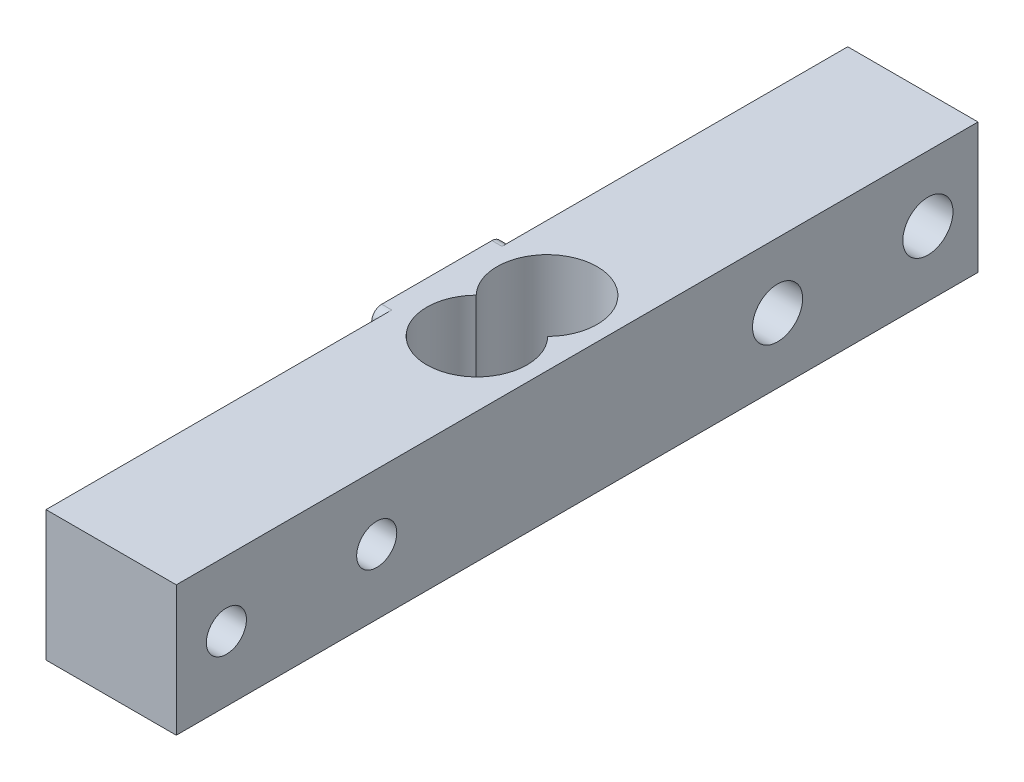
ISO-10303-21;
HEADER;
FILE_DESCRIPTION(('STEP AP214'),'2;1');
FILE_NAME('part.step','',(''),(''),'','','');
FILE_SCHEMA(('AUTOMOTIVE_DESIGN { 1 0 10303 214 1 1 1 1 }'));
ENDSEC;
DATA;
#1=APPLICATION_CONTEXT('core data for automotive mechanical design processes');
#2=APPLICATION_PROTOCOL_DEFINITION('international standard','automotive_design',2000,#1);
#3=PRODUCT_CONTEXT('',#1,'mechanical');
#4=PRODUCT('Part','Part','',(#3));
#5=PRODUCT_RELATED_PRODUCT_CATEGORY('part','',(#4));
#6=PRODUCT_DEFINITION_FORMATION('','',#4);
#7=PRODUCT_DEFINITION_CONTEXT('part definition',#1,'design');
#8=PRODUCT_DEFINITION('design','',#6,#7);
#9=PRODUCT_DEFINITION_SHAPE('','',#8);
#10=(LENGTH_UNIT() NAMED_UNIT(*) SI_UNIT(.MILLI.,.METRE.));
#11=(NAMED_UNIT(*) PLANE_ANGLE_UNIT() SI_UNIT($,.RADIAN.));
#12=(NAMED_UNIT(*) SI_UNIT($,.STERADIAN.) SOLID_ANGLE_UNIT());
#13=UNCERTAINTY_MEASURE_WITH_UNIT(LENGTH_MEASURE(1.E-05),#10,'distance_accuracy_value','');
#14=(GEOMETRIC_REPRESENTATION_CONTEXT(3) GLOBAL_UNCERTAINTY_ASSIGNED_CONTEXT((#13)) GLOBAL_UNIT_ASSIGNED_CONTEXT((#10,
#11,#12)) REPRESENTATION_CONTEXT('',''));
#15=CARTESIAN_POINT('',(0.,0.,0.));
#16=DIRECTION('',(0.,0.,1.));
#17=DIRECTION('',(1.,0.,0.));
#18=AXIS2_PLACEMENT_3D('',#15,#16,#17);
#19=CARTESIAN_POINT('',(-6.5,6.5,40.));
#20=DIRECTION('',(1.,0.,0.));
#21=DIRECTION('',(0.,1.,0.));
#22=AXIS2_PLACEMENT_3D('',#19,#20,#21);
#23=PLANE('',#22);
#24=CARTESIAN_POINT('',(-6.5,0.,20.));
#25=DIRECTION('',(1.,0.,0.));
#26=DIRECTION('',(0.,0.,-1.));
#27=AXIS2_PLACEMENT_3D('',#24,#25,#26);
#28=CIRCLE('',#27,2.);
#29=CARTESIAN_POINT('',(-6.5,0.,18.));
#30=VERTEX_POINT('',#29);
#31=EDGE_CURVE('E262',#30,#30,#28,.T.);
#32=ORIENTED_EDGE('',*,*,#31,.T.);
#33=EDGE_LOOP('',(#32));
#34=FACE_BOUND('',#33,.T.);
#35=CARTESIAN_POINT('',(-6.5,0.,35.));
#36=DIRECTION('',(1.,0.,0.));
#37=DIRECTION('',(0.,0.,-1.));
#38=AXIS2_PLACEMENT_3D('',#35,#36,#37);
#39=CIRCLE('',#38,2.);
#40=CARTESIAN_POINT('',(-6.5,0.,33.));
#41=VERTEX_POINT('',#40);
#42=EDGE_CURVE('E162',#41,#41,#39,.T.);
#43=ORIENTED_EDGE('',*,*,#42,.T.);
#44=EDGE_LOOP('',(#43));
#45=FACE_BOUND('',#44,.T.);
#46=DIRECTION('',(0.,1.,0.));
#47=VECTOR('',#46,1.);
#48=CARTESIAN_POINT('',(-6.5,6.5,6.5));
#49=LINE('',#48,#47);
#50=CARTESIAN_POINT('',(-6.5,-5.5,6.5));
#51=VERTEX_POINT('',#50);
#52=CARTESIAN_POINT('',(-6.5,5.5,6.5));
#53=VERTEX_POINT('',#52);
#54=EDGE_CURVE('E253',#51,#53,#49,.T.);
#55=ORIENTED_EDGE('',*,*,#54,.F.);
#56=CARTESIAN_POINT('',(-6.5,-5.5,5.5));
#57=DIRECTION('',(1.,0.,0.));
#58=DIRECTION('',(0.,1.,0.));
#59=AXIS2_PLACEMENT_3D('',#56,#57,#58);
#60=CIRCLE('',#59,1.);
#61=CARTESIAN_POINT('',(-6.5,-6.5,5.5));
#62=VERTEX_POINT('',#61);
#63=EDGE_CURVE('E224',#51,#62,#60,.T.);
#64=ORIENTED_EDGE('',*,*,#63,.T.);
#65=DIRECTION('',(0.,0.,-1.));
#66=VECTOR('',#65,1.);
#67=CARTESIAN_POINT('',(-6.5,-6.5,40.));
#68=LINE('',#67,#66);
#69=CARTESIAN_POINT('',(-6.5,-6.5,40.));
#70=VERTEX_POINT('',#69);
#71=EDGE_CURVE('E189',#70,#62,#68,.T.);
#72=ORIENTED_EDGE('',*,*,#71,.F.);
#73=DIRECTION('',(0.,-1.,0.));
#74=VECTOR('',#73,1.);
#75=CARTESIAN_POINT('',(-6.5,6.5,40.));
#76=LINE('',#75,#74);
#77=CARTESIAN_POINT('',(-6.5,6.5,40.));
#78=VERTEX_POINT('',#77);
#79=EDGE_CURVE('E172',#78,#70,#76,.T.);
#80=ORIENTED_EDGE('',*,*,#79,.F.);
#81=DIRECTION('',(0.,0.,-1.));
#82=VECTOR('',#81,1.);
#83=CARTESIAN_POINT('',(-6.5,6.5,40.));
#84=LINE('',#83,#82);
#85=CARTESIAN_POINT('',(-6.5,6.5,5.5));
#86=VERTEX_POINT('',#85);
#87=EDGE_CURVE('E192',#78,#86,#84,.T.);
#88=ORIENTED_EDGE('',*,*,#87,.T.);
#89=CARTESIAN_POINT('',(-6.5,5.5,5.5));
#90=DIRECTION('',(1.,0.,0.));
#91=DIRECTION('',(0.,1.,0.));
#92=AXIS2_PLACEMENT_3D('',#89,#90,#91);
#93=CIRCLE('',#92,1.);
#94=EDGE_CURVE('E227',#86,#53,#93,.T.);
#95=ORIENTED_EDGE('',*,*,#94,.T.);
#96=EDGE_LOOP('',(#55,#64,#72,#80,#88,#95));
#97=FACE_BOUND('',#96,.T.);
#98=ADVANCED_FACE('F35',(#34,#45,#97),#23,.F.);
#99=CARTESIAN_POINT('',(-6.5,0.,-35.));
#100=DIRECTION('',(1.,0.,0.));
#101=DIRECTION('',(0.,0.,-1.));
#102=AXIS2_PLACEMENT_3D('',#99,#100,#101);
#103=CIRCLE('',#102,2.5);
#104=CARTESIAN_POINT('',(-6.5,0.,-37.5));
#105=VERTEX_POINT('',#104);
#106=EDGE_CURVE('E273',#105,#105,#103,.T.);
#107=ORIENTED_EDGE('',*,*,#106,.T.);
#108=EDGE_LOOP('',(#107));
#109=FACE_BOUND('',#108,.T.);
#110=CARTESIAN_POINT('',(-6.5,0.,-20.));
#111=DIRECTION('',(1.,0.,0.));
#112=DIRECTION('',(0.,0.,-1.));
#113=AXIS2_PLACEMENT_3D('',#110,#111,#112);
#114=CIRCLE('',#113,2.5);
#115=CARTESIAN_POINT('',(-6.5,0.,-22.5));
#116=VERTEX_POINT('',#115);
#117=EDGE_CURVE('E268',#116,#116,#114,.T.);
#118=ORIENTED_EDGE('',*,*,#117,.T.);
#119=EDGE_LOOP('',(#118));
#120=FACE_BOUND('',#119,.T.);
#121=DIRECTION('',(0.,-1.,0.));
#122=VECTOR('',#121,1.);
#123=CARTESIAN_POINT('',(-6.5,6.5,-6.5));
#124=LINE('',#123,#122);
#125=CARTESIAN_POINT('',(-6.5,5.5,-6.5));
#126=VERTEX_POINT('',#125);
#127=CARTESIAN_POINT('',(-6.5,-5.5,-6.5));
#128=VERTEX_POINT('',#127);
#129=EDGE_CURVE('E229',#126,#128,#124,.T.);
#130=ORIENTED_EDGE('',*,*,#129,.F.);
#131=CARTESIAN_POINT('',(-6.5,5.5,-5.5));
#132=DIRECTION('',(1.,0.,0.));
#133=DIRECTION('',(0.,1.,0.));
#134=AXIS2_PLACEMENT_3D('',#131,#132,#133);
#135=CIRCLE('',#134,1.);
#136=CARTESIAN_POINT('',(-6.5,6.5,-5.5));
#137=VERTEX_POINT('',#136);
#138=EDGE_CURVE('E43',#126,#137,#135,.T.);
#139=ORIENTED_EDGE('',*,*,#138,.T.);
#140=CARTESIAN_POINT('',(-6.5,6.5,-40.));
#141=VERTEX_POINT('',#140);
#142=EDGE_CURVE('E191',#137,#141,#84,.T.);
#143=ORIENTED_EDGE('',*,*,#142,.T.);
#144=DIRECTION('',(0.,-1.,0.));
#145=VECTOR('',#144,1.);
#146=CARTESIAN_POINT('',(-6.5,6.5,-40.));
#147=LINE('',#146,#145);
#148=CARTESIAN_POINT('',(-6.5,-6.5,-40.));
#149=VERTEX_POINT('',#148);
#150=EDGE_CURVE('E182',#141,#149,#147,.T.);
#151=ORIENTED_EDGE('',*,*,#150,.T.);
#152=CARTESIAN_POINT('',(-6.5,-6.5,-5.5));
#153=VERTEX_POINT('',#152);
#154=EDGE_CURVE('E188',#153,#149,#68,.T.);
#155=ORIENTED_EDGE('',*,*,#154,.F.);
#156=CARTESIAN_POINT('',(-6.5,-5.5,-5.5));
#157=DIRECTION('',(1.,0.,0.));
#158=DIRECTION('',(0.,1.,0.));
#159=AXIS2_PLACEMENT_3D('',#156,#157,#158);
#160=CIRCLE('',#159,1.);
#161=EDGE_CURVE('E11',#153,#128,#160,.T.);
#162=ORIENTED_EDGE('',*,*,#161,.T.);
#163=EDGE_LOOP('',(#130,#139,#143,#151,#155,#162));
#164=FACE_BOUND('',#163,.T.);
#165=ADVANCED_FACE('F228',(#109,#120,#164),#23,.F.);
#166=CARTESIAN_POINT('',(6.5,6.5,40.));
#167=DIRECTION('',(-1.,0.,0.));
#168=DIRECTION('',(0.,0.,1.));
#169=AXIS2_PLACEMENT_3D('',#166,#167,#168);
#170=PLANE('',#169);
#171=CARTESIAN_POINT('',(6.5,0.,35.));
#172=DIRECTION('',(1.,0.,0.));
#173=DIRECTION('',(0.,0.,-1.));
#174=AXIS2_PLACEMENT_3D('',#171,#172,#173);
#175=CIRCLE('',#174,2.);
#176=CARTESIAN_POINT('',(6.5,0.,33.));
#177=VERTEX_POINT('',#176);
#178=EDGE_CURVE('E259',#177,#177,#175,.T.);
#179=ORIENTED_EDGE('',*,*,#178,.F.);
#180=EDGE_LOOP('',(#179));
#181=FACE_BOUND('',#180,.T.);
#182=CARTESIAN_POINT('',(6.5,0.,20.));
#183=DIRECTION('',(1.,0.,0.));
#184=DIRECTION('',(0.,0.,-1.));
#185=AXIS2_PLACEMENT_3D('',#182,#183,#184);
#186=CIRCLE('',#185,2.);
#187=CARTESIAN_POINT('',(6.5,0.,18.));
#188=VERTEX_POINT('',#187);
#189=EDGE_CURVE('E265',#188,#188,#186,.T.);
#190=ORIENTED_EDGE('',*,*,#189,.F.);
#191=EDGE_LOOP('',(#190));
#192=FACE_BOUND('',#191,.T.);
#193=CARTESIAN_POINT('',(6.5,0.,-20.));
#194=DIRECTION('',(1.,0.,0.));
#195=DIRECTION('',(0.,0.,-1.));
#196=AXIS2_PLACEMENT_3D('',#193,#194,#195);
#197=CIRCLE('',#196,2.5);
#198=CARTESIAN_POINT('',(6.5,0.,-22.5));
#199=VERTEX_POINT('',#198);
#200=EDGE_CURVE('E271',#199,#199,#197,.T.);
#201=ORIENTED_EDGE('',*,*,#200,.F.);
#202=EDGE_LOOP('',(#201));
#203=FACE_BOUND('',#202,.T.);
#204=CARTESIAN_POINT('',(6.5,0.,-35.));
#205=DIRECTION('',(1.,0.,0.));
#206=DIRECTION('',(0.,0.,-1.));
#207=AXIS2_PLACEMENT_3D('',#204,#205,#206);
#208=CIRCLE('',#207,2.5);
#209=CARTESIAN_POINT('',(6.5,0.,-37.5));
#210=VERTEX_POINT('',#209);
#211=EDGE_CURVE('E159',#210,#210,#208,.T.);
#212=ORIENTED_EDGE('',*,*,#211,.F.);
#213=EDGE_LOOP('',(#212));
#214=FACE_BOUND('',#213,.T.);
#215=DIRECTION('',(0.,1.,0.));
#216=VECTOR('',#215,1.);
#217=CARTESIAN_POINT('',(6.5,6.5,-40.));
#218=LINE('',#217,#216);
#219=CARTESIAN_POINT('',(6.5,-6.5,-40.));
#220=VERTEX_POINT('',#219);
#221=CARTESIAN_POINT('',(6.5,6.5,-40.));
#222=VERTEX_POINT('',#221);
#223=EDGE_CURVE('E164',#220,#222,#218,.T.);
#224=ORIENTED_EDGE('',*,*,#223,.T.);
#225=DIRECTION('',(0.,0.,-1.));
#226=VECTOR('',#225,1.);
#227=CARTESIAN_POINT('',(6.5,6.5,40.));
#228=LINE('',#227,#226);
#229=CARTESIAN_POINT('',(6.5,6.5,40.));
#230=VERTEX_POINT('',#229);
#231=EDGE_CURVE('E194',#230,#222,#228,.T.);
#232=ORIENTED_EDGE('',*,*,#231,.F.);
#233=DIRECTION('',(0.,1.,0.));
#234=VECTOR('',#233,1.);
#235=CARTESIAN_POINT('',(6.5,6.5,40.));
#236=LINE('',#235,#234);
#237=CARTESIAN_POINT('',(6.5,-6.5,40.));
#238=VERTEX_POINT('',#237);
#239=EDGE_CURVE('E166',#238,#230,#236,.T.);
#240=ORIENTED_EDGE('',*,*,#239,.F.);
#241=DIRECTION('',(0.,0.,-1.));
#242=VECTOR('',#241,1.);
#243=CARTESIAN_POINT('',(6.5,-6.5,40.));
#244=LINE('',#243,#242);
#245=EDGE_CURVE('E176',#238,#220,#244,.T.);
#246=ORIENTED_EDGE('',*,*,#245,.T.);
#247=EDGE_LOOP('',(#224,#232,#240,#246));
#248=FACE_BOUND('',#247,.T.);
#249=ADVANCED_FACE('F282',(#181,#192,#203,#214,#248),#170,.F.);
#250=CARTESIAN_POINT('',(-6.5,6.5,40.));
#251=DIRECTION('',(0.,-1.,0.));
#252=DIRECTION('',(1.,0.,0.));
#253=AXIS2_PLACEMENT_3D('',#250,#251,#252);
#254=PLANE('',#253);
#255=CARTESIAN_POINT('',(0.,6.5,-3.5));
#256=DIRECTION('',(0.,1.,0.));
#257=DIRECTION('',(-1.,0.,0.));
#258=AXIS2_PLACEMENT_3D('',#255,#256,#257);
#259=CIRCLE('',#258,5.);
#260=CARTESIAN_POINT('',(3.57071421427142,6.5,0.));
#261=VERTEX_POINT('',#260);
#262=CARTESIAN_POINT('',(-3.57071421427143,6.5,0.));
#263=VERTEX_POINT('',#262);
#264=EDGE_CURVE('E155',#261,#263,#259,.T.);
#265=ORIENTED_EDGE('',*,*,#264,.F.);
#266=CARTESIAN_POINT('',(0.,6.5,3.5));
#267=DIRECTION('',(0.,1.,0.));
#268=DIRECTION('',(-1.,0.,0.));
#269=AXIS2_PLACEMENT_3D('',#266,#267,#268);
#270=CIRCLE('',#269,5.);
#271=EDGE_CURVE('E142',#263,#261,#270,.T.);
#272=ORIENTED_EDGE('',*,*,#271,.F.);
#273=EDGE_LOOP('',(#265,#272));
#274=FACE_BOUND('',#273,.T.);
#275=DIRECTION('',(0.,0.,-1.));
#276=VECTOR('',#275,1.);
#277=CARTESIAN_POINT('',(-7.5,6.5,-6.5));
#278=LINE('',#277,#276);
#279=CARTESIAN_POINT('',(-7.5,6.5,5.49999999999999));
#280=VERTEX_POINT('',#279);
#281=CARTESIAN_POINT('',(-7.5,6.5,-5.5));
#282=VERTEX_POINT('',#281);
#283=EDGE_CURVE('E236',#280,#282,#278,.T.);
#284=ORIENTED_EDGE('',*,*,#283,.F.);
#285=DIRECTION('',(1.,0.,0.));
#286=VECTOR('',#285,1.);
#287=CARTESIAN_POINT('',(-6.5,6.5,5.5));
#288=LINE('',#287,#286);
#289=EDGE_CURVE('E217',#280,#86,#288,.T.);
#290=ORIENTED_EDGE('',*,*,#289,.T.);
#291=ORIENTED_EDGE('',*,*,#87,.F.);
#292=DIRECTION('',(-1.,0.,0.));
#293=VECTOR('',#292,1.);
#294=CARTESIAN_POINT('',(-6.5,6.5,40.));
#295=LINE('',#294,#293);
#296=EDGE_CURVE('E169',#230,#78,#295,.T.);
#297=ORIENTED_EDGE('',*,*,#296,.F.);
#298=ORIENTED_EDGE('',*,*,#231,.T.);
#299=DIRECTION('',(-1.,0.,0.));
#300=VECTOR('',#299,1.);
#301=CARTESIAN_POINT('',(-6.5,6.5,-40.));
#302=LINE('',#301,#300);
#303=EDGE_CURVE('E179',#222,#141,#302,.T.);
#304=ORIENTED_EDGE('',*,*,#303,.T.);
#305=ORIENTED_EDGE('',*,*,#142,.F.);
#306=DIRECTION('',(1.,0.,0.));
#307=VECTOR('',#306,1.);
#308=CARTESIAN_POINT('',(-6.5,6.5,-5.5));
#309=LINE('',#308,#307);
#310=EDGE_CURVE('E215',#137,#282,#309,.F.);
#311=ORIENTED_EDGE('',*,*,#310,.T.);
#312=EDGE_LOOP('',(#284,#290,#291,#297,#298,#304,#305,#311));
#313=FACE_BOUND('',#312,.T.);
#314=ADVANCED_FACE('F235',(#274,#313),#254,.F.);
#315=CARTESIAN_POINT('',(-6.5,-6.5,40.));
#316=DIRECTION('',(0.,1.,0.));
#317=DIRECTION('',(-1.,0.,0.));
#318=AXIS2_PLACEMENT_3D('',#315,#316,#317);
#319=PLANE('',#318);
#320=CARTESIAN_POINT('',(0.,-6.5,-3.5));
#321=DIRECTION('',(0.,1.,0.));
#322=DIRECTION('',(-1.,0.,0.));
#323=AXIS2_PLACEMENT_3D('',#320,#321,#322);
#324=CIRCLE('',#323,5.);
#325=CARTESIAN_POINT('',(3.57071421427143,-6.5,0.));
#326=VERTEX_POINT('',#325);
#327=CARTESIAN_POINT('',(-3.57071421427142,-6.5,0.));
#328=VERTEX_POINT('',#327);
#329=EDGE_CURVE('E147',#326,#328,#324,.T.);
#330=ORIENTED_EDGE('',*,*,#329,.T.);
#331=CARTESIAN_POINT('',(0.,-6.5,3.5));
#332=DIRECTION('',(0.,1.,0.));
#333=DIRECTION('',(-1.,0.,0.));
#334=AXIS2_PLACEMENT_3D('',#331,#332,#333);
#335=CIRCLE('',#334,5.);
#336=EDGE_CURVE('E139',#328,#326,#335,.T.);
#337=ORIENTED_EDGE('',*,*,#336,.T.);
#338=EDGE_LOOP('',(#330,#337));
#339=FACE_BOUND('',#338,.T.);
#340=ORIENTED_EDGE('',*,*,#71,.T.);
#341=DIRECTION('',(1.,0.,0.));
#342=VECTOR('',#341,1.);
#343=CARTESIAN_POINT('',(-6.5,-6.5,5.5));
#344=LINE('',#343,#342);
#345=CARTESIAN_POINT('',(-7.5,-6.5,5.5));
#346=VERTEX_POINT('',#345);
#347=EDGE_CURVE('E205',#62,#346,#344,.F.);
#348=ORIENTED_EDGE('',*,*,#347,.T.);
#349=DIRECTION('',(0.,0.,1.));
#350=VECTOR('',#349,1.);
#351=CARTESIAN_POINT('',(-7.5,-6.5,-6.5));
#352=LINE('',#351,#350);
#353=CARTESIAN_POINT('',(-7.5,-6.5,-5.5));
#354=VERTEX_POINT('',#353);
#355=EDGE_CURVE('E248',#354,#346,#352,.T.);
#356=ORIENTED_EDGE('',*,*,#355,.F.);
#357=DIRECTION('',(1.,0.,0.));
#358=VECTOR('',#357,1.);
#359=CARTESIAN_POINT('',(-6.5,-6.5,-5.5));
#360=LINE('',#359,#358);
#361=EDGE_CURVE('E202',#354,#153,#360,.T.);
#362=ORIENTED_EDGE('',*,*,#361,.T.);
#363=ORIENTED_EDGE('',*,*,#154,.T.);
#364=DIRECTION('',(1.,0.,0.));
#365=VECTOR('',#364,1.);
#366=CARTESIAN_POINT('',(-6.5,-6.5,-40.));
#367=LINE('',#366,#365);
#368=EDGE_CURVE('E170',#149,#220,#367,.T.);
#369=ORIENTED_EDGE('',*,*,#368,.T.);
#370=ORIENTED_EDGE('',*,*,#245,.F.);
#371=DIRECTION('',(1.,0.,0.));
#372=VECTOR('',#371,1.);
#373=CARTESIAN_POINT('',(-6.5,-6.5,40.));
#374=LINE('',#373,#372);
#375=EDGE_CURVE('E174',#70,#238,#374,.T.);
#376=ORIENTED_EDGE('',*,*,#375,.F.);
#377=EDGE_LOOP('',(#340,#348,#356,#362,#363,#369,#370,#376));
#378=FACE_BOUND('',#377,.T.);
#379=ADVANCED_FACE('F153',(#339,#378),#319,.F.);
#380=CARTESIAN_POINT('',(0.,0.,40.));
#381=DIRECTION('',(0.,0.,1.));
#382=DIRECTION('',(1.,0.,0.));
#383=AXIS2_PLACEMENT_3D('',#380,#381,#382);
#384=PLANE('',#383);
#385=ORIENTED_EDGE('',*,*,#239,.T.);
#386=ORIENTED_EDGE('',*,*,#296,.T.);
#387=ORIENTED_EDGE('',*,*,#79,.T.);
#388=ORIENTED_EDGE('',*,*,#375,.T.);
#389=EDGE_LOOP('',(#385,#386,#387,#388));
#390=FACE_BOUND('',#389,.T.);
#391=ADVANCED_FACE('F298',(#390),#384,.T.);
#392=CARTESIAN_POINT('',(0.,0.,-40.));
#393=DIRECTION('',(0.,0.,1.));
#394=DIRECTION('',(1.,0.,0.));
#395=AXIS2_PLACEMENT_3D('',#392,#393,#394);
#396=PLANE('',#395);
#397=ORIENTED_EDGE('',*,*,#223,.F.);
#398=ORIENTED_EDGE('',*,*,#368,.F.);
#399=ORIENTED_EDGE('',*,*,#150,.F.);
#400=ORIENTED_EDGE('',*,*,#303,.F.);
#401=EDGE_LOOP('',(#397,#398,#399,#400));
#402=FACE_BOUND('',#401,.T.);
#403=ADVANCED_FACE('F293',(#402),#396,.F.);
#404=CARTESIAN_POINT('',(0.,-6.5,3.5));
#405=DIRECTION('',(0.,1.,0.));
#406=DIRECTION('',(-1.,0.,0.));
#407=AXIS2_PLACEMENT_3D('',#404,#405,#406);
#408=CYLINDRICAL_SURFACE('',#407,5.);
#409=ORIENTED_EDGE('',*,*,#271,.T.);
#410=DIRECTION('',(0.,1.,0.));
#411=VECTOR('',#410,1.);
#412=CARTESIAN_POINT('',(3.57071421427143,-6.5,0.));
#413=LINE('',#412,#411);
#414=EDGE_CURVE('E135',#326,#261,#413,.T.);
#415=ORIENTED_EDGE('',*,*,#414,.F.);
#416=ORIENTED_EDGE('',*,*,#336,.F.);
#417=DIRECTION('',(0.,1.,0.));
#418=VECTOR('',#417,1.);
#419=CARTESIAN_POINT('',(-3.57071421427142,-6.5,0.));
#420=LINE('',#419,#418);
#421=EDGE_CURVE('E146',#328,#263,#420,.T.);
#422=ORIENTED_EDGE('',*,*,#421,.T.);
#423=EDGE_LOOP('',(#409,#415,#416,#422));
#424=FACE_BOUND('',#423,.T.);
#425=ADVANCED_FACE('F137',(#424),#408,.F.);
#426=CARTESIAN_POINT('',(0.,-6.5,-3.5));
#427=DIRECTION('',(0.,1.,0.));
#428=DIRECTION('',(-1.,0.,0.));
#429=AXIS2_PLACEMENT_3D('',#426,#427,#428);
#430=CYLINDRICAL_SURFACE('',#429,5.);
#431=ORIENTED_EDGE('',*,*,#264,.T.);
#432=ORIENTED_EDGE('',*,*,#421,.F.);
#433=ORIENTED_EDGE('',*,*,#329,.F.);
#434=ORIENTED_EDGE('',*,*,#414,.T.);
#435=EDGE_LOOP('',(#431,#432,#433,#434));
#436=FACE_BOUND('',#435,.T.);
#437=ADVANCED_FACE('F150',(#436),#430,.F.);
#438=CARTESIAN_POINT('',(-6.5,0.,-35.));
#439=DIRECTION('',(1.,0.,0.));
#440=DIRECTION('',(0.,0.,-1.));
#441=AXIS2_PLACEMENT_3D('',#438,#439,#440);
#442=CYLINDRICAL_SURFACE('',#441,2.5);
#443=CARTESIAN_POINT('',(-6.5,0.,-37.5));
#444=CARTESIAN_POINT('',(-6.36458333333333,0.,-37.5));
#445=CARTESIAN_POINT('',(-6.22916666666667,0.,-37.5));
#446=CARTESIAN_POINT('',(-5.95833333333333,0.,-37.5));
#447=CARTESIAN_POINT('',(-5.82291666666667,0.,-37.5));
#448=CARTESIAN_POINT('',(-5.55208333333333,0.,-37.5));
#449=CARTESIAN_POINT('',(-5.41666666666667,0.,-37.5));
#450=CARTESIAN_POINT('',(-5.14583333333333,0.,-37.5));
#451=CARTESIAN_POINT('',(-5.01041666666667,0.,-37.5));
#452=CARTESIAN_POINT('',(-4.73958333333333,0.,-37.5));
#453=CARTESIAN_POINT('',(-4.60416666666667,0.,-37.5));
#454=CARTESIAN_POINT('',(-4.33333333333333,0.,-37.5));
#455=CARTESIAN_POINT('',(-4.19791666666667,0.,-37.5));
#456=CARTESIAN_POINT('',(-3.92708333333333,0.,-37.5));
#457=CARTESIAN_POINT('',(-3.79166666666667,0.,-37.5));
#458=CARTESIAN_POINT('',(-3.52083333333333,0.,-37.5));
#459=CARTESIAN_POINT('',(-3.38541666666667,0.,-37.5));
#460=CARTESIAN_POINT('',(-3.11458333333333,0.,-37.5));
#461=CARTESIAN_POINT('',(-2.97916666666667,0.,-37.5));
#462=CARTESIAN_POINT('',(-2.70833333333333,0.,-37.5));
#463=CARTESIAN_POINT('',(-2.57291666666667,0.,-37.5));
#464=CARTESIAN_POINT('',(-2.30208333333333,0.,-37.5));
#465=CARTESIAN_POINT('',(-2.16666666666667,0.,-37.5));
#466=CARTESIAN_POINT('',(-1.89583333333333,0.,-37.5));
#467=CARTESIAN_POINT('',(-1.76041666666667,0.,-37.5));
#468=CARTESIAN_POINT('',(-1.48958333333333,0.,-37.5));
#469=CARTESIAN_POINT('',(-1.35416666666667,0.,-37.5));
#470=CARTESIAN_POINT('',(-1.08333333333333,0.,-37.5));
#471=CARTESIAN_POINT('',(-0.947916666666668,0.,-37.5));
#472=CARTESIAN_POINT('',(-0.677083333333334,0.,-37.5));
#473=CARTESIAN_POINT('',(-0.541666666666668,0.,-37.5));
#474=CARTESIAN_POINT('',(-0.270833333333334,0.,-37.5));
#475=CARTESIAN_POINT('',(-0.135416666666668,0.,-37.5));
#476=CARTESIAN_POINT('',(0.135416666666666,0.,-37.5));
#477=CARTESIAN_POINT('',(0.270833333333333,0.,-37.5));
#478=CARTESIAN_POINT('',(0.541666666666666,0.,-37.5));
#479=CARTESIAN_POINT('',(0.677083333333332,0.,-37.5));
#480=CARTESIAN_POINT('',(0.947916666666666,0.,-37.5));
#481=CARTESIAN_POINT('',(1.08333333333333,0.,-37.5));
#482=CARTESIAN_POINT('',(1.35416666666667,0.,-37.5));
#483=CARTESIAN_POINT('',(1.48958333333333,0.,-37.5));
#484=CARTESIAN_POINT('',(1.76041666666667,0.,-37.5));
#485=CARTESIAN_POINT('',(1.89583333333333,0.,-37.5));
#486=CARTESIAN_POINT('',(2.16666666666667,0.,-37.5));
#487=CARTESIAN_POINT('',(2.30208333333333,0.,-37.5));
#488=CARTESIAN_POINT('',(2.57291666666667,0.,-37.5));
#489=CARTESIAN_POINT('',(2.70833333333333,0.,-37.5));
#490=CARTESIAN_POINT('',(2.97916666666667,0.,-37.5));
#491=CARTESIAN_POINT('',(3.11458333333333,0.,-37.5));
#492=CARTESIAN_POINT('',(3.38541666666667,0.,-37.5));
#493=CARTESIAN_POINT('',(3.52083333333333,0.,-37.5));
#494=CARTESIAN_POINT('',(3.79166666666667,0.,-37.5));
#495=CARTESIAN_POINT('',(3.92708333333333,0.,-37.5));
#496=CARTESIAN_POINT('',(4.19791666666667,0.,-37.5));
#497=CARTESIAN_POINT('',(4.33333333333333,0.,-37.5));
#498=CARTESIAN_POINT('',(4.60416666666667,0.,-37.5));
#499=CARTESIAN_POINT('',(4.73958333333333,0.,-37.5));
#500=CARTESIAN_POINT('',(5.01041666666667,0.,-37.5));
#501=CARTESIAN_POINT('',(5.14583333333333,0.,-37.5));
#502=CARTESIAN_POINT('',(5.41666666666667,0.,-37.5));
#503=CARTESIAN_POINT('',(5.55208333333333,0.,-37.5));
#504=CARTESIAN_POINT('',(5.82291666666667,0.,-37.5));
#505=CARTESIAN_POINT('',(5.95833333333333,0.,-37.5));
#506=CARTESIAN_POINT('',(6.22916666666667,0.,-37.5));
#507=CARTESIAN_POINT('',(6.36458333333333,0.,-37.5));
#508=CARTESIAN_POINT('',(6.5,0.,-37.5));
#509=B_SPLINE_CURVE_WITH_KNOTS('',3,(#443,#444,#445,#446,#447,#448,#449,#450,#451,#452,#453,
#454,#455,#456,#457,#458,#459,#460,#461,#462,#463,#464,#465,#466,#467,#468,#469,#470,#471,#472,
#473,#474,#475,#476,#477,#478,#479,#480,#481,#482,#483,#484,#485,#486,#487,#488,#489,#490,#491,
#492,#493,#494,#495,#496,#497,#498,#499,#500,#501,#502,#503,#504,#505,#506,#507,#508),
.UNSPECIFIED.,.F.,.F.,(4,2,2,2,2,2,2,2,2,2,2,2,2,2,2,2,2,2,2,2,2,2,2,2,2,2,2,2,2,2,2,2,4),(0.,
0.40625,0.812500000000001,1.21875,1.625,2.03125,2.4375,2.84375,3.25,3.65625,4.0625,4.46875,
4.875,5.28125,5.6875,6.09375,6.5,6.90625,7.3125,7.71875,8.125,8.53125,8.9375,9.34375,9.75,
10.15625,10.5625,10.96875,11.375,11.78125,12.1875,12.59375,13.),.UNSPECIFIED.);
#510=EDGE_CURVE('BSEAM280',#105,#210,#509,.T.);
#511=ORIENTED_EDGE('',*,*,#106,.F.);
#512=ORIENTED_EDGE('',*,*,#211,.T.);
#513=ORIENTED_EDGE('',*,*,#510,.T.);
#514=ORIENTED_EDGE('',*,*,#510,.F.);
#515=EDGE_LOOP('',(#511,#513,#512,#514));
#516=FACE_BOUND('',#515,.T.);
#517=ADVANCED_FACE('F280',(#516),#442,.F.);
#518=CARTESIAN_POINT('',(-6.5,0.,-20.));
#519=DIRECTION('',(1.,0.,0.));
#520=DIRECTION('',(0.,0.,-1.));
#521=AXIS2_PLACEMENT_3D('',#518,#519,#520);
#522=CYLINDRICAL_SURFACE('',#521,2.5);
#523=CARTESIAN_POINT('',(-6.5,0.,-22.5));
#524=CARTESIAN_POINT('',(-6.36458333333333,0.,-22.5));
#525=CARTESIAN_POINT('',(-6.22916666666667,0.,-22.5));
#526=CARTESIAN_POINT('',(-5.95833333333333,0.,-22.5));
#527=CARTESIAN_POINT('',(-5.82291666666667,0.,-22.5));
#528=CARTESIAN_POINT('',(-5.55208333333333,0.,-22.5));
#529=CARTESIAN_POINT('',(-5.41666666666667,0.,-22.5));
#530=CARTESIAN_POINT('',(-5.14583333333333,0.,-22.5));
#531=CARTESIAN_POINT('',(-5.01041666666667,0.,-22.5));
#532=CARTESIAN_POINT('',(-4.73958333333333,0.,-22.5));
#533=CARTESIAN_POINT('',(-4.60416666666667,0.,-22.5));
#534=CARTESIAN_POINT('',(-4.33333333333333,0.,-22.5));
#535=CARTESIAN_POINT('',(-4.19791666666667,0.,-22.5));
#536=CARTESIAN_POINT('',(-3.92708333333333,0.,-22.5));
#537=CARTESIAN_POINT('',(-3.79166666666667,0.,-22.5));
#538=CARTESIAN_POINT('',(-3.52083333333333,0.,-22.5));
#539=CARTESIAN_POINT('',(-3.38541666666667,0.,-22.5));
#540=CARTESIAN_POINT('',(-3.11458333333333,0.,-22.5));
#541=CARTESIAN_POINT('',(-2.97916666666667,0.,-22.5));
#542=CARTESIAN_POINT('',(-2.70833333333333,0.,-22.5));
#543=CARTESIAN_POINT('',(-2.57291666666667,0.,-22.5));
#544=CARTESIAN_POINT('',(-2.30208333333333,0.,-22.5));
#545=CARTESIAN_POINT('',(-2.16666666666667,0.,-22.5));
#546=CARTESIAN_POINT('',(-1.89583333333333,0.,-22.5));
#547=CARTESIAN_POINT('',(-1.76041666666667,0.,-22.5));
#548=CARTESIAN_POINT('',(-1.48958333333333,0.,-22.5));
#549=CARTESIAN_POINT('',(-1.35416666666667,0.,-22.5));
#550=CARTESIAN_POINT('',(-1.08333333333333,0.,-22.5));
#551=CARTESIAN_POINT('',(-0.947916666666668,0.,-22.5));
#552=CARTESIAN_POINT('',(-0.677083333333334,0.,-22.5));
#553=CARTESIAN_POINT('',(-0.541666666666668,0.,-22.5));
#554=CARTESIAN_POINT('',(-0.270833333333334,0.,-22.5));
#555=CARTESIAN_POINT('',(-0.135416666666668,0.,-22.5));
#556=CARTESIAN_POINT('',(0.135416666666666,0.,-22.5));
#557=CARTESIAN_POINT('',(0.270833333333333,0.,-22.5));
#558=CARTESIAN_POINT('',(0.541666666666666,0.,-22.5));
#559=CARTESIAN_POINT('',(0.677083333333332,0.,-22.5));
#560=CARTESIAN_POINT('',(0.947916666666666,0.,-22.5));
#561=CARTESIAN_POINT('',(1.08333333333333,0.,-22.5));
#562=CARTESIAN_POINT('',(1.35416666666667,0.,-22.5));
#563=CARTESIAN_POINT('',(1.48958333333333,0.,-22.5));
#564=CARTESIAN_POINT('',(1.76041666666667,0.,-22.5));
#565=CARTESIAN_POINT('',(1.89583333333333,0.,-22.5));
#566=CARTESIAN_POINT('',(2.16666666666667,0.,-22.5));
#567=CARTESIAN_POINT('',(2.30208333333333,0.,-22.5));
#568=CARTESIAN_POINT('',(2.57291666666667,0.,-22.5));
#569=CARTESIAN_POINT('',(2.70833333333333,0.,-22.5));
#570=CARTESIAN_POINT('',(2.97916666666667,0.,-22.5));
#571=CARTESIAN_POINT('',(3.11458333333333,0.,-22.5));
#572=CARTESIAN_POINT('',(3.38541666666667,0.,-22.5));
#573=CARTESIAN_POINT('',(3.52083333333333,0.,-22.5));
#574=CARTESIAN_POINT('',(3.79166666666667,0.,-22.5));
#575=CARTESIAN_POINT('',(3.92708333333333,0.,-22.5));
#576=CARTESIAN_POINT('',(4.19791666666667,0.,-22.5));
#577=CARTESIAN_POINT('',(4.33333333333333,0.,-22.5));
#578=CARTESIAN_POINT('',(4.60416666666667,0.,-22.5));
#579=CARTESIAN_POINT('',(4.73958333333333,0.,-22.5));
#580=CARTESIAN_POINT('',(5.01041666666667,0.,-22.5));
#581=CARTESIAN_POINT('',(5.14583333333333,0.,-22.5));
#582=CARTESIAN_POINT('',(5.41666666666667,0.,-22.5));
#583=CARTESIAN_POINT('',(5.55208333333333,0.,-22.5));
#584=CARTESIAN_POINT('',(5.82291666666667,0.,-22.5));
#585=CARTESIAN_POINT('',(5.95833333333333,0.,-22.5));
#586=CARTESIAN_POINT('',(6.22916666666667,0.,-22.5));
#587=CARTESIAN_POINT('',(6.36458333333333,0.,-22.5));
#588=CARTESIAN_POINT('',(6.5,0.,-22.5));
#589=B_SPLINE_CURVE_WITH_KNOTS('',3,(#523,#524,#525,#526,#527,#528,#529,#530,#531,#532,#533,
#534,#535,#536,#537,#538,#539,#540,#541,#542,#543,#544,#545,#546,#547,#548,#549,#550,#551,#552,
#553,#554,#555,#556,#557,#558,#559,#560,#561,#562,#563,#564,#565,#566,#567,#568,#569,#570,#571,
#572,#573,#574,#575,#576,#577,#578,#579,#580,#581,#582,#583,#584,#585,#586,#587,#588),
.UNSPECIFIED.,.F.,.F.,(4,2,2,2,2,2,2,2,2,2,2,2,2,2,2,2,2,2,2,2,2,2,2,2,2,2,2,2,2,2,2,2,4),(0.,
0.40625,0.812500000000001,1.21875,1.625,2.03125,2.4375,2.84375,3.25,3.65625,4.0625,4.46875,
4.875,5.28125,5.6875,6.09375,6.5,6.90625,7.3125,7.71875,8.125,8.53125,8.9375,9.34375,9.75,
10.15625,10.5625,10.96875,11.375,11.78125,12.1875,12.59375,13.),.UNSPECIFIED.);
#590=EDGE_CURVE('BSEAM437',#116,#199,#589,.T.);
#591=ORIENTED_EDGE('',*,*,#117,.F.);
#592=ORIENTED_EDGE('',*,*,#200,.T.);
#593=ORIENTED_EDGE('',*,*,#590,.T.);
#594=ORIENTED_EDGE('',*,*,#590,.F.);
#595=EDGE_LOOP('',(#591,#593,#592,#594));
#596=FACE_BOUND('',#595,.T.);
#597=ADVANCED_FACE('F437',(#596),#522,.F.);
#598=CARTESIAN_POINT('',(-6.5,0.,20.));
#599=DIRECTION('',(1.,0.,0.));
#600=DIRECTION('',(0.,0.,-1.));
#601=AXIS2_PLACEMENT_3D('',#598,#599,#600);
#602=CYLINDRICAL_SURFACE('',#601,2.);
#603=CARTESIAN_POINT('',(-6.5,0.,18.));
#604=CARTESIAN_POINT('',(-6.36458333333333,0.,18.));
#605=CARTESIAN_POINT('',(-6.22916666666667,0.,18.));
#606=CARTESIAN_POINT('',(-5.95833333333333,0.,18.));
#607=CARTESIAN_POINT('',(-5.82291666666667,0.,18.));
#608=CARTESIAN_POINT('',(-5.55208333333333,0.,18.));
#609=CARTESIAN_POINT('',(-5.41666666666667,0.,18.));
#610=CARTESIAN_POINT('',(-5.14583333333333,0.,18.));
#611=CARTESIAN_POINT('',(-5.01041666666667,0.,18.));
#612=CARTESIAN_POINT('',(-4.73958333333333,0.,18.));
#613=CARTESIAN_POINT('',(-4.60416666666667,0.,18.));
#614=CARTESIAN_POINT('',(-4.33333333333333,0.,18.));
#615=CARTESIAN_POINT('',(-4.19791666666667,0.,18.));
#616=CARTESIAN_POINT('',(-3.92708333333333,0.,18.));
#617=CARTESIAN_POINT('',(-3.79166666666667,0.,18.));
#618=CARTESIAN_POINT('',(-3.52083333333333,0.,18.));
#619=CARTESIAN_POINT('',(-3.38541666666667,0.,18.));
#620=CARTESIAN_POINT('',(-3.11458333333333,0.,18.));
#621=CARTESIAN_POINT('',(-2.97916666666667,0.,18.));
#622=CARTESIAN_POINT('',(-2.70833333333333,0.,18.));
#623=CARTESIAN_POINT('',(-2.57291666666667,0.,18.));
#624=CARTESIAN_POINT('',(-2.30208333333333,0.,18.));
#625=CARTESIAN_POINT('',(-2.16666666666667,0.,18.));
#626=CARTESIAN_POINT('',(-1.89583333333333,0.,18.));
#627=CARTESIAN_POINT('',(-1.76041666666667,0.,18.));
#628=CARTESIAN_POINT('',(-1.48958333333333,0.,18.));
#629=CARTESIAN_POINT('',(-1.35416666666667,0.,18.));
#630=CARTESIAN_POINT('',(-1.08333333333333,0.,18.));
#631=CARTESIAN_POINT('',(-0.947916666666668,0.,18.));
#632=CARTESIAN_POINT('',(-0.677083333333334,0.,18.));
#633=CARTESIAN_POINT('',(-0.541666666666668,0.,18.));
#634=CARTESIAN_POINT('',(-0.270833333333334,0.,18.));
#635=CARTESIAN_POINT('',(-0.135416666666668,0.,18.));
#636=CARTESIAN_POINT('',(0.135416666666666,0.,18.));
#637=CARTESIAN_POINT('',(0.270833333333333,0.,18.));
#638=CARTESIAN_POINT('',(0.541666666666666,0.,18.));
#639=CARTESIAN_POINT('',(0.677083333333332,0.,18.));
#640=CARTESIAN_POINT('',(0.947916666666666,0.,18.));
#641=CARTESIAN_POINT('',(1.08333333333333,0.,18.));
#642=CARTESIAN_POINT('',(1.35416666666667,0.,18.));
#643=CARTESIAN_POINT('',(1.48958333333333,0.,18.));
#644=CARTESIAN_POINT('',(1.76041666666667,0.,18.));
#645=CARTESIAN_POINT('',(1.89583333333333,0.,18.));
#646=CARTESIAN_POINT('',(2.16666666666667,0.,18.));
#647=CARTESIAN_POINT('',(2.30208333333333,0.,18.));
#648=CARTESIAN_POINT('',(2.57291666666667,0.,18.));
#649=CARTESIAN_POINT('',(2.70833333333333,0.,18.));
#650=CARTESIAN_POINT('',(2.97916666666667,0.,18.));
#651=CARTESIAN_POINT('',(3.11458333333333,0.,18.));
#652=CARTESIAN_POINT('',(3.38541666666667,0.,18.));
#653=CARTESIAN_POINT('',(3.52083333333333,0.,18.));
#654=CARTESIAN_POINT('',(3.79166666666667,0.,18.));
#655=CARTESIAN_POINT('',(3.92708333333333,0.,18.));
#656=CARTESIAN_POINT('',(4.19791666666667,0.,18.));
#657=CARTESIAN_POINT('',(4.33333333333333,0.,18.));
#658=CARTESIAN_POINT('',(4.60416666666667,0.,18.));
#659=CARTESIAN_POINT('',(4.73958333333333,0.,18.));
#660=CARTESIAN_POINT('',(5.01041666666667,0.,18.));
#661=CARTESIAN_POINT('',(5.14583333333333,0.,18.));
#662=CARTESIAN_POINT('',(5.41666666666667,0.,18.));
#663=CARTESIAN_POINT('',(5.55208333333333,0.,18.));
#664=CARTESIAN_POINT('',(5.82291666666667,0.,18.));
#665=CARTESIAN_POINT('',(5.95833333333333,0.,18.));
#666=CARTESIAN_POINT('',(6.22916666666667,0.,18.));
#667=CARTESIAN_POINT('',(6.36458333333333,0.,18.));
#668=CARTESIAN_POINT('',(6.5,0.,18.));
#669=B_SPLINE_CURVE_WITH_KNOTS('',3,(#603,#604,#605,#606,#607,#608,#609,#610,#611,#612,#613,
#614,#615,#616,#617,#618,#619,#620,#621,#622,#623,#624,#625,#626,#627,#628,#629,#630,#631,#632,
#633,#634,#635,#636,#637,#638,#639,#640,#641,#642,#643,#644,#645,#646,#647,#648,#649,#650,#651,
#652,#653,#654,#655,#656,#657,#658,#659,#660,#661,#662,#663,#664,#665,#666,#667,#668),
.UNSPECIFIED.,.F.,.F.,(4,2,2,2,2,2,2,2,2,2,2,2,2,2,2,2,2,2,2,2,2,2,2,2,2,2,2,2,2,2,2,2,4),(0.,
0.40625,0.812500000000001,1.21875,1.625,2.03125,2.4375,2.84375,3.25,3.65625,4.0625,4.46875,
4.875,5.28125,5.6875,6.09375,6.5,6.90625,7.3125,7.71875,8.125,8.53125,8.9375,9.34375,9.75,
10.15625,10.5625,10.96875,11.375,11.78125,12.1875,12.59375,13.),.UNSPECIFIED.);
#670=EDGE_CURVE('BSEAM428',#30,#188,#669,.T.);
#671=ORIENTED_EDGE('',*,*,#31,.F.);
#672=ORIENTED_EDGE('',*,*,#189,.T.);
#673=ORIENTED_EDGE('',*,*,#670,.T.);
#674=ORIENTED_EDGE('',*,*,#670,.F.);
#675=EDGE_LOOP('',(#671,#673,#672,#674));
#676=FACE_BOUND('',#675,.T.);
#677=ADVANCED_FACE('F428',(#676),#602,.F.);
#678=CARTESIAN_POINT('',(-6.5,0.,35.));
#679=DIRECTION('',(1.,0.,0.));
#680=DIRECTION('',(0.,0.,-1.));
#681=AXIS2_PLACEMENT_3D('',#678,#679,#680);
#682=CYLINDRICAL_SURFACE('',#681,2.);
#683=CARTESIAN_POINT('',(-6.5,0.,33.));
#684=CARTESIAN_POINT('',(-6.36458333333333,0.,33.));
#685=CARTESIAN_POINT('',(-6.22916666666667,0.,33.));
#686=CARTESIAN_POINT('',(-5.95833333333333,0.,33.));
#687=CARTESIAN_POINT('',(-5.82291666666667,0.,33.));
#688=CARTESIAN_POINT('',(-5.55208333333333,0.,33.));
#689=CARTESIAN_POINT('',(-5.41666666666667,0.,33.));
#690=CARTESIAN_POINT('',(-5.14583333333333,0.,33.));
#691=CARTESIAN_POINT('',(-5.01041666666667,0.,33.));
#692=CARTESIAN_POINT('',(-4.73958333333333,0.,33.));
#693=CARTESIAN_POINT('',(-4.60416666666667,0.,33.));
#694=CARTESIAN_POINT('',(-4.33333333333333,0.,33.));
#695=CARTESIAN_POINT('',(-4.19791666666667,0.,33.));
#696=CARTESIAN_POINT('',(-3.92708333333333,0.,33.));
#697=CARTESIAN_POINT('',(-3.79166666666667,0.,33.));
#698=CARTESIAN_POINT('',(-3.52083333333333,0.,33.));
#699=CARTESIAN_POINT('',(-3.38541666666667,0.,33.));
#700=CARTESIAN_POINT('',(-3.11458333333333,0.,33.));
#701=CARTESIAN_POINT('',(-2.97916666666667,0.,33.));
#702=CARTESIAN_POINT('',(-2.70833333333333,0.,33.));
#703=CARTESIAN_POINT('',(-2.57291666666667,0.,33.));
#704=CARTESIAN_POINT('',(-2.30208333333333,0.,33.));
#705=CARTESIAN_POINT('',(-2.16666666666667,0.,33.));
#706=CARTESIAN_POINT('',(-1.89583333333333,0.,33.));
#707=CARTESIAN_POINT('',(-1.76041666666667,0.,33.));
#708=CARTESIAN_POINT('',(-1.48958333333333,0.,33.));
#709=CARTESIAN_POINT('',(-1.35416666666667,0.,33.));
#710=CARTESIAN_POINT('',(-1.08333333333333,0.,33.));
#711=CARTESIAN_POINT('',(-0.947916666666668,0.,33.));
#712=CARTESIAN_POINT('',(-0.677083333333334,0.,33.));
#713=CARTESIAN_POINT('',(-0.541666666666668,0.,33.));
#714=CARTESIAN_POINT('',(-0.270833333333334,0.,33.));
#715=CARTESIAN_POINT('',(-0.135416666666668,0.,33.));
#716=CARTESIAN_POINT('',(0.135416666666666,0.,33.));
#717=CARTESIAN_POINT('',(0.270833333333333,0.,33.));
#718=CARTESIAN_POINT('',(0.541666666666666,0.,33.));
#719=CARTESIAN_POINT('',(0.677083333333332,0.,33.));
#720=CARTESIAN_POINT('',(0.947916666666666,0.,33.));
#721=CARTESIAN_POINT('',(1.08333333333333,0.,33.));
#722=CARTESIAN_POINT('',(1.35416666666667,0.,33.));
#723=CARTESIAN_POINT('',(1.48958333333333,0.,33.));
#724=CARTESIAN_POINT('',(1.76041666666667,0.,33.));
#725=CARTESIAN_POINT('',(1.89583333333333,0.,33.));
#726=CARTESIAN_POINT('',(2.16666666666667,0.,33.));
#727=CARTESIAN_POINT('',(2.30208333333333,0.,33.));
#728=CARTESIAN_POINT('',(2.57291666666667,0.,33.));
#729=CARTESIAN_POINT('',(2.70833333333333,0.,33.));
#730=CARTESIAN_POINT('',(2.97916666666667,0.,33.));
#731=CARTESIAN_POINT('',(3.11458333333333,0.,33.));
#732=CARTESIAN_POINT('',(3.38541666666667,0.,33.));
#733=CARTESIAN_POINT('',(3.52083333333333,0.,33.));
#734=CARTESIAN_POINT('',(3.79166666666667,0.,33.));
#735=CARTESIAN_POINT('',(3.92708333333333,0.,33.));
#736=CARTESIAN_POINT('',(4.19791666666667,0.,33.));
#737=CARTESIAN_POINT('',(4.33333333333333,0.,33.));
#738=CARTESIAN_POINT('',(4.60416666666667,0.,33.));
#739=CARTESIAN_POINT('',(4.73958333333333,0.,33.));
#740=CARTESIAN_POINT('',(5.01041666666667,0.,33.));
#741=CARTESIAN_POINT('',(5.14583333333333,0.,33.));
#742=CARTESIAN_POINT('',(5.41666666666667,0.,33.));
#743=CARTESIAN_POINT('',(5.55208333333333,0.,33.));
#744=CARTESIAN_POINT('',(5.82291666666667,0.,33.));
#745=CARTESIAN_POINT('',(5.95833333333333,0.,33.));
#746=CARTESIAN_POINT('',(6.22916666666667,0.,33.));
#747=CARTESIAN_POINT('',(6.36458333333333,0.,33.));
#748=CARTESIAN_POINT('',(6.5,0.,33.));
#749=B_SPLINE_CURVE_WITH_KNOTS('',3,(#683,#684,#685,#686,#687,#688,#689,#690,#691,#692,#693,
#694,#695,#696,#697,#698,#699,#700,#701,#702,#703,#704,#705,#706,#707,#708,#709,#710,#711,#712,
#713,#714,#715,#716,#717,#718,#719,#720,#721,#722,#723,#724,#725,#726,#727,#728,#729,#730,#731,
#732,#733,#734,#735,#736,#737,#738,#739,#740,#741,#742,#743,#744,#745,#746,#747,#748),
.UNSPECIFIED.,.F.,.F.,(4,2,2,2,2,2,2,2,2,2,2,2,2,2,2,2,2,2,2,2,2,2,2,2,2,2,2,2,2,2,2,2,4),(0.,
0.40625,0.812500000000001,1.21875,1.625,2.03125,2.4375,2.84375,3.25,3.65625,4.0625,4.46875,
4.875,5.28125,5.6875,6.09375,6.5,6.90625,7.3125,7.71875,8.125,8.53125,8.9375,9.34375,9.75,
10.15625,10.5625,10.96875,11.375,11.78125,12.1875,12.59375,13.),.UNSPECIFIED.);
#750=EDGE_CURVE('BSEAM392',#41,#177,#749,.T.);
#751=ORIENTED_EDGE('',*,*,#42,.F.);
#752=ORIENTED_EDGE('',*,*,#178,.T.);
#753=ORIENTED_EDGE('',*,*,#750,.T.);
#754=ORIENTED_EDGE('',*,*,#750,.F.);
#755=EDGE_LOOP('',(#751,#753,#752,#754));
#756=FACE_BOUND('',#755,.T.);
#757=ADVANCED_FACE('F392',(#756),#682,.F.);
#758=CARTESIAN_POINT('',(-7.5,6.5,6.5));
#759=DIRECTION('',(0.,0.,-1.));
#760=DIRECTION('',(-1.,0.,0.));
#761=AXIS2_PLACEMENT_3D('',#758,#759,#760);
#762=PLANE('',#761);
#763=DIRECTION('',(0.,1.,0.));
#764=VECTOR('',#763,1.);
#765=CARTESIAN_POINT('',(-7.5,6.5,6.5));
#766=LINE('',#765,#764);
#767=CARTESIAN_POINT('',(-7.5,-5.5,6.5));
#768=VERTEX_POINT('',#767);
#769=CARTESIAN_POINT('',(-7.5,5.5,6.5));
#770=VERTEX_POINT('',#769);
#771=EDGE_CURVE('E246',#768,#770,#766,.T.);
#772=ORIENTED_EDGE('',*,*,#771,.F.);
#773=DIRECTION('',(1.,0.,0.));
#774=VECTOR('',#773,1.);
#775=CARTESIAN_POINT('',(-7.5,-5.5,6.5));
#776=LINE('',#775,#774);
#777=EDGE_CURVE('E199',#768,#51,#776,.T.);
#778=ORIENTED_EDGE('',*,*,#777,.T.);
#779=ORIENTED_EDGE('',*,*,#54,.T.);
#780=DIRECTION('',(1.,0.,0.));
#781=VECTOR('',#780,1.);
#782=CARTESIAN_POINT('',(-7.5,5.5,6.5));
#783=LINE('',#782,#781);
#784=EDGE_CURVE('E197',#53,#770,#783,.F.);
#785=ORIENTED_EDGE('',*,*,#784,.T.);
#786=EDGE_LOOP('',(#772,#778,#779,#785));
#787=FACE_BOUND('',#786,.T.);
#788=ADVANCED_FACE('F315',(#787),#762,.F.);
#789=CARTESIAN_POINT('',(-7.5,6.5,-6.5));
#790=DIRECTION('',(0.,0.,1.));
#791=DIRECTION('',(1.,0.,0.));
#792=AXIS2_PLACEMENT_3D('',#789,#790,#791);
#793=PLANE('',#792);
#794=DIRECTION('',(0.,-1.,0.));
#795=VECTOR('',#794,1.);
#796=CARTESIAN_POINT('',(-7.5,6.5,-6.5));
#797=LINE('',#796,#795);
#798=CARTESIAN_POINT('',(-7.5,5.5,-6.5));
#799=VERTEX_POINT('',#798);
#800=CARTESIAN_POINT('',(-7.5,-5.5,-6.5));
#801=VERTEX_POINT('',#800);
#802=EDGE_CURVE('E245',#799,#801,#797,.T.);
#803=ORIENTED_EDGE('',*,*,#802,.F.);
#804=DIRECTION('',(1.,0.,0.));
#805=VECTOR('',#804,1.);
#806=CARTESIAN_POINT('',(-7.5,5.5,-6.5));
#807=LINE('',#806,#805);
#808=EDGE_CURVE('E222',#799,#126,#807,.T.);
#809=ORIENTED_EDGE('',*,*,#808,.T.);
#810=ORIENTED_EDGE('',*,*,#129,.T.);
#811=DIRECTION('',(1.,0.,0.));
#812=VECTOR('',#811,1.);
#813=CARTESIAN_POINT('',(-7.5,-5.5,-6.5));
#814=LINE('',#813,#812);
#815=EDGE_CURVE('E220',#128,#801,#814,.F.);
#816=ORIENTED_EDGE('',*,*,#815,.T.);
#817=EDGE_LOOP('',(#803,#809,#810,#816));
#818=FACE_BOUND('',#817,.T.);
#819=ADVANCED_FACE('F307',(#818),#793,.F.);
#820=CARTESIAN_POINT('',(-7.5,0.,0.));
#821=DIRECTION('',(-1.,0.,0.));
#822=DIRECTION('',(0.,-1.,0.));
#823=AXIS2_PLACEMENT_3D('',#820,#821,#822);
#824=PLANE('',#823);
#825=ORIENTED_EDGE('',*,*,#355,.T.);
#826=CARTESIAN_POINT('',(-7.5,-5.5,5.5));
#827=DIRECTION('',(-1.,0.,0.));
#828=DIRECTION('',(0.,-1.,0.));
#829=AXIS2_PLACEMENT_3D('',#826,#827,#828);
#830=CIRCLE('',#829,1.);
#831=EDGE_CURVE('E213',#346,#768,#830,.T.);
#832=ORIENTED_EDGE('',*,*,#831,.T.);
#833=ORIENTED_EDGE('',*,*,#771,.T.);
#834=CARTESIAN_POINT('',(-7.5,5.5,5.5));
#835=DIRECTION('',(-1.,0.,0.));
#836=DIRECTION('',(0.,-1.,0.));
#837=AXIS2_PLACEMENT_3D('',#834,#835,#836);
#838=CIRCLE('',#837,1.);
#839=EDGE_CURVE('E211',#770,#280,#838,.T.);
#840=ORIENTED_EDGE('',*,*,#839,.T.);
#841=ORIENTED_EDGE('',*,*,#283,.T.);
#842=CARTESIAN_POINT('',(-7.5,5.5,-5.5));
#843=DIRECTION('',(-1.,0.,0.));
#844=DIRECTION('',(0.,-1.,0.));
#845=AXIS2_PLACEMENT_3D('',#842,#843,#844);
#846=CIRCLE('',#845,1.);
#847=EDGE_CURVE('E209',#282,#799,#846,.T.);
#848=ORIENTED_EDGE('',*,*,#847,.T.);
#849=ORIENTED_EDGE('',*,*,#802,.T.);
#850=CARTESIAN_POINT('',(-7.5,-5.5,-5.5));
#851=DIRECTION('',(-1.,0.,0.));
#852=DIRECTION('',(0.,-1.,0.));
#853=AXIS2_PLACEMENT_3D('',#850,#851,#852);
#854=CIRCLE('',#853,1.);
#855=EDGE_CURVE('E207',#801,#354,#854,.T.);
#856=ORIENTED_EDGE('',*,*,#855,.T.);
#857=EDGE_LOOP('',(#825,#832,#833,#840,#841,#848,#849,#856));
#858=FACE_BOUND('',#857,.T.);
#859=ADVANCED_FACE('F240',(#858),#824,.T.);
#860=CARTESIAN_POINT('',(-7.5,-5.5,5.5));
#861=DIRECTION('',(1.,0.,0.));
#862=DIRECTION('',(0.,1.,0.));
#863=AXIS2_PLACEMENT_3D('',#860,#861,#862);
#864=CYLINDRICAL_SURFACE('',#863,1.);
#865=ORIENTED_EDGE('',*,*,#831,.F.);
#866=ORIENTED_EDGE('',*,*,#347,.F.);
#867=ORIENTED_EDGE('',*,*,#63,.F.);
#868=ORIENTED_EDGE('',*,*,#777,.F.);
#869=EDGE_LOOP('',(#865,#866,#867,#868));
#870=FACE_BOUND('',#869,.T.);
#871=ADVANCED_FACE('F311',(#870),#864,.T.);
#872=CARTESIAN_POINT('',(-6.5,5.5,5.5));
#873=DIRECTION('',(1.,0.,0.));
#874=DIRECTION('',(0.,1.,0.));
#875=AXIS2_PLACEMENT_3D('',#872,#873,#874);
#876=CYLINDRICAL_SURFACE('',#875,1.);
#877=ORIENTED_EDGE('',*,*,#839,.F.);
#878=ORIENTED_EDGE('',*,*,#784,.F.);
#879=ORIENTED_EDGE('',*,*,#94,.F.);
#880=ORIENTED_EDGE('',*,*,#289,.F.);
#881=EDGE_LOOP('',(#877,#878,#879,#880));
#882=FACE_BOUND('',#881,.T.);
#883=ADVANCED_FACE('F320',(#882),#876,.T.);
#884=CARTESIAN_POINT('',(-7.5,5.5,-5.5));
#885=DIRECTION('',(1.,0.,0.));
#886=DIRECTION('',(0.,1.,0.));
#887=AXIS2_PLACEMENT_3D('',#884,#885,#886);
#888=CYLINDRICAL_SURFACE('',#887,1.);
#889=ORIENTED_EDGE('',*,*,#847,.F.);
#890=ORIENTED_EDGE('',*,*,#310,.F.);
#891=ORIENTED_EDGE('',*,*,#138,.F.);
#892=ORIENTED_EDGE('',*,*,#808,.F.);
#893=EDGE_LOOP('',(#889,#890,#891,#892));
#894=FACE_BOUND('',#893,.T.);
#895=ADVANCED_FACE('F231',(#894),#888,.T.);
#896=CARTESIAN_POINT('',(-6.5,-5.5,-5.5));
#897=DIRECTION('',(1.,0.,0.));
#898=DIRECTION('',(0.,1.,0.));
#899=AXIS2_PLACEMENT_3D('',#896,#897,#898);
#900=CYLINDRICAL_SURFACE('',#899,1.);
#901=ORIENTED_EDGE('',*,*,#855,.F.);
#902=ORIENTED_EDGE('',*,*,#815,.F.);
#903=ORIENTED_EDGE('',*,*,#161,.F.);
#904=ORIENTED_EDGE('',*,*,#361,.F.);
#905=EDGE_LOOP('',(#901,#902,#903,#904));
#906=FACE_BOUND('',#905,.T.);
#907=ADVANCED_FACE('F37',(#906),#900,.T.);
#908=CLOSED_SHELL('',(#98,#165,#249,#314,#379,#391,#403,#425,#437,#517,#597,#677,#757,#788,#819,
#859,#871,#883,#895,#907));
#909=MANIFOLD_SOLID_BREP('B2',#908);
#910=ADVANCED_BREP_SHAPE_REPRESENTATION('',(#18,#909),#14);
#911=SHAPE_DEFINITION_REPRESENTATION(#9,#910);
ENDSEC;
END-ISO-10303-21;
